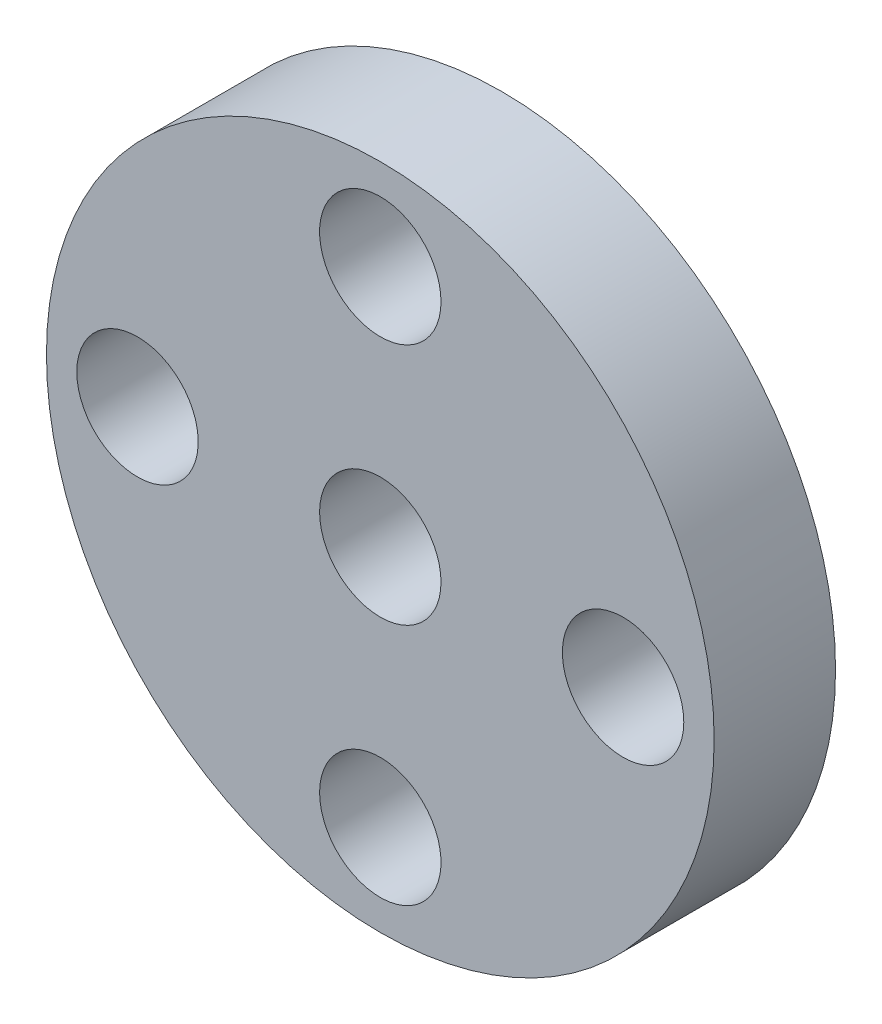
ISO-10303-21;
HEADER;
FILE_DESCRIPTION(('STEP AP214'),'2;1');
FILE_NAME('part.step','',(''),(''),'','','');
FILE_SCHEMA(('AUTOMOTIVE_DESIGN { 1 0 10303 214 1 1 1 1 }'));
ENDSEC;
DATA;
#1=APPLICATION_CONTEXT('core data for automotive mechanical design processes');
#2=APPLICATION_PROTOCOL_DEFINITION('international standard','automotive_design',2000,#1);
#3=PRODUCT_CONTEXT('',#1,'mechanical');
#4=PRODUCT('Part','Part','',(#3));
#5=PRODUCT_RELATED_PRODUCT_CATEGORY('part','',(#4));
#6=PRODUCT_DEFINITION_FORMATION('','',#4);
#7=PRODUCT_DEFINITION_CONTEXT('part definition',#1,'design');
#8=PRODUCT_DEFINITION('design','',#6,#7);
#9=PRODUCT_DEFINITION_SHAPE('','',#8);
#10=(LENGTH_UNIT() NAMED_UNIT(*) SI_UNIT(.MILLI.,.METRE.));
#11=(NAMED_UNIT(*) PLANE_ANGLE_UNIT() SI_UNIT($,.RADIAN.));
#12=(NAMED_UNIT(*) SI_UNIT($,.STERADIAN.) SOLID_ANGLE_UNIT());
#13=UNCERTAINTY_MEASURE_WITH_UNIT(LENGTH_MEASURE(1.E-05),#10,'distance_accuracy_value','');
#14=(GEOMETRIC_REPRESENTATION_CONTEXT(3) GLOBAL_UNCERTAINTY_ASSIGNED_CONTEXT((#13)) GLOBAL_UNIT_ASSIGNED_CONTEXT((#10,
#11,#12)) REPRESENTATION_CONTEXT('',''));
#15=CARTESIAN_POINT('',(0.,0.,0.));
#16=DIRECTION('',(0.,0.,1.));
#17=DIRECTION('',(1.,0.,0.));
#18=AXIS2_PLACEMENT_3D('',#15,#16,#17);
#19=CARTESIAN_POINT('',(0.,0.,0.));
#20=DIRECTION('',(0.,0.,1.));
#21=DIRECTION('',(1.,0.,0.));
#22=AXIS2_PLACEMENT_3D('',#19,#20,#21);
#23=PLANE('',#22);
#24=CARTESIAN_POINT('',(0.,-8.,0.));
#25=DIRECTION('',(0.,0.,1.));
#26=DIRECTION('',(-1.,0.,0.));
#27=AXIS2_PLACEMENT_3D('',#24,#25,#26);
#28=CIRCLE('',#27,2.);
#29=CARTESIAN_POINT('',(-2.,-8.,0.));
#30=VERTEX_POINT('',#29);
#31=EDGE_CURVE('E72',#30,#30,#28,.T.);
#32=ORIENTED_EDGE('',*,*,#31,.T.);
#33=EDGE_LOOP('',(#32));
#34=FACE_BOUND('',#33,.T.);
#35=CARTESIAN_POINT('',(-8.,0.,0.));
#36=DIRECTION('',(0.,0.,1.));
#37=DIRECTION('',(-1.,0.,0.));
#38=AXIS2_PLACEMENT_3D('',#35,#36,#37);
#39=CIRCLE('',#38,2.);
#40=CARTESIAN_POINT('',(-10.,0.,0.));
#41=VERTEX_POINT('',#40);
#42=EDGE_CURVE('E66',#41,#41,#39,.T.);
#43=ORIENTED_EDGE('',*,*,#42,.T.);
#44=EDGE_LOOP('',(#43));
#45=FACE_BOUND('',#44,.T.);
#46=CARTESIAN_POINT('',(0.,8.,0.));
#47=DIRECTION('',(0.,0.,1.));
#48=DIRECTION('',(1.,0.,0.));
#49=AXIS2_PLACEMENT_3D('',#46,#47,#48);
#50=CIRCLE('',#49,2.);
#51=CARTESIAN_POINT('',(2.,8.,0.));
#52=VERTEX_POINT('',#51);
#53=EDGE_CURVE('E60',#52,#52,#50,.T.);
#54=ORIENTED_EDGE('',*,*,#53,.T.);
#55=EDGE_LOOP('',(#54));
#56=FACE_BOUND('',#55,.T.);
#57=CARTESIAN_POINT('',(8.,0.,0.));
#58=DIRECTION('',(0.,0.,1.));
#59=DIRECTION('',(1.,0.,0.));
#60=AXIS2_PLACEMENT_3D('',#57,#58,#59);
#61=CIRCLE('',#60,2.);
#62=CARTESIAN_POINT('',(10.,0.,0.));
#63=VERTEX_POINT('',#62);
#64=EDGE_CURVE('E54',#63,#63,#61,.T.);
#65=ORIENTED_EDGE('',*,*,#64,.T.);
#66=EDGE_LOOP('',(#65));
#67=FACE_BOUND('',#66,.T.);
#68=CARTESIAN_POINT('',(0.,0.,0.));
#69=DIRECTION('',(0.,0.,1.));
#70=DIRECTION('',(1.,0.,0.));
#71=AXIS2_PLACEMENT_3D('',#68,#69,#70);
#72=CIRCLE('',#71,11.);
#73=CARTESIAN_POINT('',(11.,0.,0.));
#74=VERTEX_POINT('',#73);
#75=EDGE_CURVE('E44',#74,#74,#72,.T.);
#76=ORIENTED_EDGE('',*,*,#75,.F.);
#77=EDGE_LOOP('',(#76));
#78=FACE_BOUND('',#77,.T.);
#79=CARTESIAN_POINT('',(0.,0.,0.));
#80=DIRECTION('',(0.,0.,1.));
#81=DIRECTION('',(1.,0.,0.));
#82=AXIS2_PLACEMENT_3D('',#79,#80,#81);
#83=CIRCLE('',#82,4.);
#84=CARTESIAN_POINT('',(4.,0.,0.));
#85=VERTEX_POINT('',#84);
#86=EDGE_CURVE('E10',#85,#85,#83,.F.);
#87=ORIENTED_EDGE('',*,*,#86,.F.);
#88=EDGE_LOOP('',(#87));
#89=FACE_BOUND('',#88,.T.);
#90=ADVANCED_FACE('F33',(#34,#45,#56,#67,#78,#89),#23,.F.);
#91=CARTESIAN_POINT('',(0.,0.,4.));
#92=DIRECTION('',(0.,0.,1.));
#93=DIRECTION('',(1.,0.,0.));
#94=AXIS2_PLACEMENT_3D('',#91,#92,#93);
#95=PLANE('',#94);
#96=CARTESIAN_POINT('',(-8.,0.,4.));
#97=DIRECTION('',(0.,0.,1.));
#98=DIRECTION('',(-1.,0.,0.));
#99=AXIS2_PLACEMENT_3D('',#96,#97,#98);
#100=CIRCLE('',#99,2.);
#101=CARTESIAN_POINT('',(-10.,0.,4.));
#102=VERTEX_POINT('',#101);
#103=EDGE_CURVE('E63',#102,#102,#100,.T.);
#104=ORIENTED_EDGE('',*,*,#103,.F.);
#105=EDGE_LOOP('',(#104));
#106=FACE_BOUND('',#105,.T.);
#107=CARTESIAN_POINT('',(8.,0.,4.));
#108=DIRECTION('',(0.,0.,1.));
#109=DIRECTION('',(1.,0.,0.));
#110=AXIS2_PLACEMENT_3D('',#107,#108,#109);
#111=CIRCLE('',#110,2.);
#112=CARTESIAN_POINT('',(10.,0.,4.));
#113=VERTEX_POINT('',#112);
#114=EDGE_CURVE('E53',#113,#113,#111,.T.);
#115=ORIENTED_EDGE('',*,*,#114,.F.);
#116=EDGE_LOOP('',(#115));
#117=FACE_BOUND('',#116,.T.);
#118=CARTESIAN_POINT('',(0.,0.,4.));
#119=DIRECTION('',(0.,0.,1.));
#120=DIRECTION('',(1.,0.,0.));
#121=AXIS2_PLACEMENT_3D('',#118,#119,#120);
#122=CIRCLE('',#121,11.);
#123=CARTESIAN_POINT('',(11.,0.,4.));
#124=VERTEX_POINT('',#123);
#125=EDGE_CURVE('E40',#124,#124,#122,.T.);
#126=ORIENTED_EDGE('',*,*,#125,.T.);
#127=EDGE_LOOP('',(#126));
#128=FACE_BOUND('',#127,.T.);
#129=CARTESIAN_POINT('',(0.,0.,4.));
#130=DIRECTION('',(0.,0.,1.));
#131=DIRECTION('',(1.,0.,0.));
#132=AXIS2_PLACEMENT_3D('',#129,#130,#131);
#133=CIRCLE('',#132,2.);
#134=CARTESIAN_POINT('',(2.,0.,4.));
#135=VERTEX_POINT('',#134);
#136=EDGE_CURVE('E49',#135,#135,#133,.T.);
#137=ORIENTED_EDGE('',*,*,#136,.F.);
#138=EDGE_LOOP('',(#137));
#139=FACE_BOUND('',#138,.T.);
#140=CARTESIAN_POINT('',(0.,8.,4.));
#141=DIRECTION('',(0.,0.,1.));
#142=DIRECTION('',(1.,0.,0.));
#143=AXIS2_PLACEMENT_3D('',#140,#141,#142);
#144=CIRCLE('',#143,2.);
#145=CARTESIAN_POINT('',(2.,8.,4.));
#146=VERTEX_POINT('',#145);
#147=EDGE_CURVE('E57',#146,#146,#144,.T.);
#148=ORIENTED_EDGE('',*,*,#147,.F.);
#149=EDGE_LOOP('',(#148));
#150=FACE_BOUND('',#149,.T.);
#151=CARTESIAN_POINT('',(0.,-8.,4.));
#152=DIRECTION('',(0.,0.,1.));
#153=DIRECTION('',(-1.,0.,0.));
#154=AXIS2_PLACEMENT_3D('',#151,#152,#153);
#155=CIRCLE('',#154,2.);
#156=CARTESIAN_POINT('',(-2.,-8.,4.));
#157=VERTEX_POINT('',#156);
#158=EDGE_CURVE('E69',#157,#157,#155,.T.);
#159=ORIENTED_EDGE('',*,*,#158,.F.);
#160=EDGE_LOOP('',(#159));
#161=FACE_BOUND('',#160,.T.);
#162=ADVANCED_FACE('F102',(#106,#117,#128,#139,#150,#161),#95,.T.);
#163=CARTESIAN_POINT('',(0.,0.,4.));
#164=DIRECTION('',(0.,0.,-1.));
#165=DIRECTION('',(-1.,0.,0.));
#166=AXIS2_PLACEMENT_3D('',#163,#164,#165);
#167=CYLINDRICAL_SURFACE('',#166,11.);
#168=ORIENTED_EDGE('',*,*,#125,.F.);
#169=EDGE_LOOP('',(#168));
#170=FACE_BOUND('',#169,.T.);
#171=ORIENTED_EDGE('',*,*,#75,.T.);
#172=EDGE_LOOP('',(#171));
#173=FACE_BOUND('',#172,.T.);
#174=ADVANCED_FACE('F35',(#170,#173),#167,.T.);
#175=CARTESIAN_POINT('',(0.,0.,4.));
#176=DIRECTION('',(0.,0.,-1.));
#177=DIRECTION('',(-1.,0.,0.));
#178=AXIS2_PLACEMENT_3D('',#175,#176,#177);
#179=CYLINDRICAL_SURFACE('',#178,2.);
#180=ORIENTED_EDGE('',*,*,#136,.T.);
#181=EDGE_LOOP('',(#180));
#182=FACE_BOUND('',#181,.T.);
#183=CARTESIAN_POINT('',(0.,0.,-4.));
#184=DIRECTION('',(0.,0.,-1.));
#185=DIRECTION('',(-1.,0.,0.));
#186=AXIS2_PLACEMENT_3D('',#183,#184,#185);
#187=CIRCLE('',#186,2.);
#188=CARTESIAN_POINT('',(-2.,0.,-4.));
#189=VERTEX_POINT('',#188);
#190=EDGE_CURVE('E80',#189,#189,#187,.T.);
#191=ORIENTED_EDGE('',*,*,#190,.T.);
#192=EDGE_LOOP('',(#191));
#193=FACE_BOUND('',#192,.T.);
#194=ADVANCED_FACE('F84',(#182,#193),#179,.F.);
#195=CARTESIAN_POINT('',(8.,0.,4.));
#196=DIRECTION('',(0.,0.,-1.));
#197=DIRECTION('',(-1.,0.,0.));
#198=AXIS2_PLACEMENT_3D('',#195,#196,#197);
#199=CYLINDRICAL_SURFACE('',#198,2.);
#200=ORIENTED_EDGE('',*,*,#114,.T.);
#201=EDGE_LOOP('',(#200));
#202=FACE_BOUND('',#201,.T.);
#203=ORIENTED_EDGE('',*,*,#64,.F.);
#204=EDGE_LOOP('',(#203));
#205=FACE_BOUND('',#204,.T.);
#206=ADVANCED_FACE('F113',(#202,#205),#199,.F.);
#207=CARTESIAN_POINT('',(0.,8.,4.));
#208=DIRECTION('',(0.,0.,-1.));
#209=DIRECTION('',(-1.,0.,0.));
#210=AXIS2_PLACEMENT_3D('',#207,#208,#209);
#211=CYLINDRICAL_SURFACE('',#210,2.);
#212=ORIENTED_EDGE('',*,*,#147,.T.);
#213=EDGE_LOOP('',(#212));
#214=FACE_BOUND('',#213,.T.);
#215=ORIENTED_EDGE('',*,*,#53,.F.);
#216=EDGE_LOOP('',(#215));
#217=FACE_BOUND('',#216,.T.);
#218=ADVANCED_FACE('F117',(#214,#217),#211,.F.);
#219=CARTESIAN_POINT('',(-8.,0.,4.));
#220=DIRECTION('',(0.,0.,-1.));
#221=DIRECTION('',(-1.,0.,0.));
#222=AXIS2_PLACEMENT_3D('',#219,#220,#221);
#223=CYLINDRICAL_SURFACE('',#222,2.);
#224=ORIENTED_EDGE('',*,*,#103,.T.);
#225=EDGE_LOOP('',(#224));
#226=FACE_BOUND('',#225,.T.);
#227=ORIENTED_EDGE('',*,*,#42,.F.);
#228=EDGE_LOOP('',(#227));
#229=FACE_BOUND('',#228,.T.);
#230=ADVANCED_FACE('F98',(#226,#229),#223,.F.);
#231=CARTESIAN_POINT('',(0.,-8.,4.));
#232=DIRECTION('',(0.,0.,-1.));
#233=DIRECTION('',(-1.,0.,0.));
#234=AXIS2_PLACEMENT_3D('',#231,#232,#233);
#235=CYLINDRICAL_SURFACE('',#234,2.);
#236=ORIENTED_EDGE('',*,*,#158,.T.);
#237=EDGE_LOOP('',(#236));
#238=FACE_BOUND('',#237,.T.);
#239=ORIENTED_EDGE('',*,*,#31,.F.);
#240=EDGE_LOOP('',(#239));
#241=FACE_BOUND('',#240,.T.);
#242=ADVANCED_FACE('F89',(#238,#241),#235,.F.);
#243=CARTESIAN_POINT('',(0.,0.,-4.));
#244=DIRECTION('',(0.,0.,-1.));
#245=DIRECTION('',(-1.,0.,0.));
#246=AXIS2_PLACEMENT_3D('',#243,#244,#245);
#247=PLANE('',#246);
#248=CARTESIAN_POINT('',(0.,0.,-4.));
#249=DIRECTION('',(0.,0.,-1.));
#250=DIRECTION('',(-1.,0.,0.));
#251=AXIS2_PLACEMENT_3D('',#248,#249,#250);
#252=CIRCLE('',#251,4.);
#253=CARTESIAN_POINT('',(-4.,0.,-4.));
#254=VERTEX_POINT('',#253);
#255=EDGE_CURVE('E75',#254,#254,#252,.T.);
#256=ORIENTED_EDGE('',*,*,#255,.T.);
#257=EDGE_LOOP('',(#256));
#258=FACE_BOUND('',#257,.T.);
#259=ORIENTED_EDGE('',*,*,#190,.F.);
#260=EDGE_LOOP('',(#259));
#261=FACE_BOUND('',#260,.T.);
#262=ADVANCED_FACE('F86',(#258,#261),#247,.T.);
#263=CARTESIAN_POINT('',(0.,0.,-4.));
#264=DIRECTION('',(0.,0.,1.));
#265=DIRECTION('',(1.,0.,0.));
#266=AXIS2_PLACEMENT_3D('',#263,#264,#265);
#267=CYLINDRICAL_SURFACE('',#266,4.);
#268=ORIENTED_EDGE('',*,*,#255,.F.);
#269=EDGE_LOOP('',(#268));
#270=FACE_BOUND('',#269,.T.);
#271=ORIENTED_EDGE('',*,*,#86,.T.);
#272=EDGE_LOOP('',(#271));
#273=FACE_BOUND('',#272,.T.);
#274=ADVANCED_FACE('F88',(#270,#273),#267,.T.);
#275=CLOSED_SHELL('',(#90,#162,#174,#194,#206,#218,#230,#242,#262,#274));
#276=MANIFOLD_SOLID_BREP('B2',#275);
#277=ADVANCED_BREP_SHAPE_REPRESENTATION('',(#18,#276),#14);
#278=SHAPE_DEFINITION_REPRESENTATION(#9,#277);
ENDSEC;
END-ISO-10303-21;
